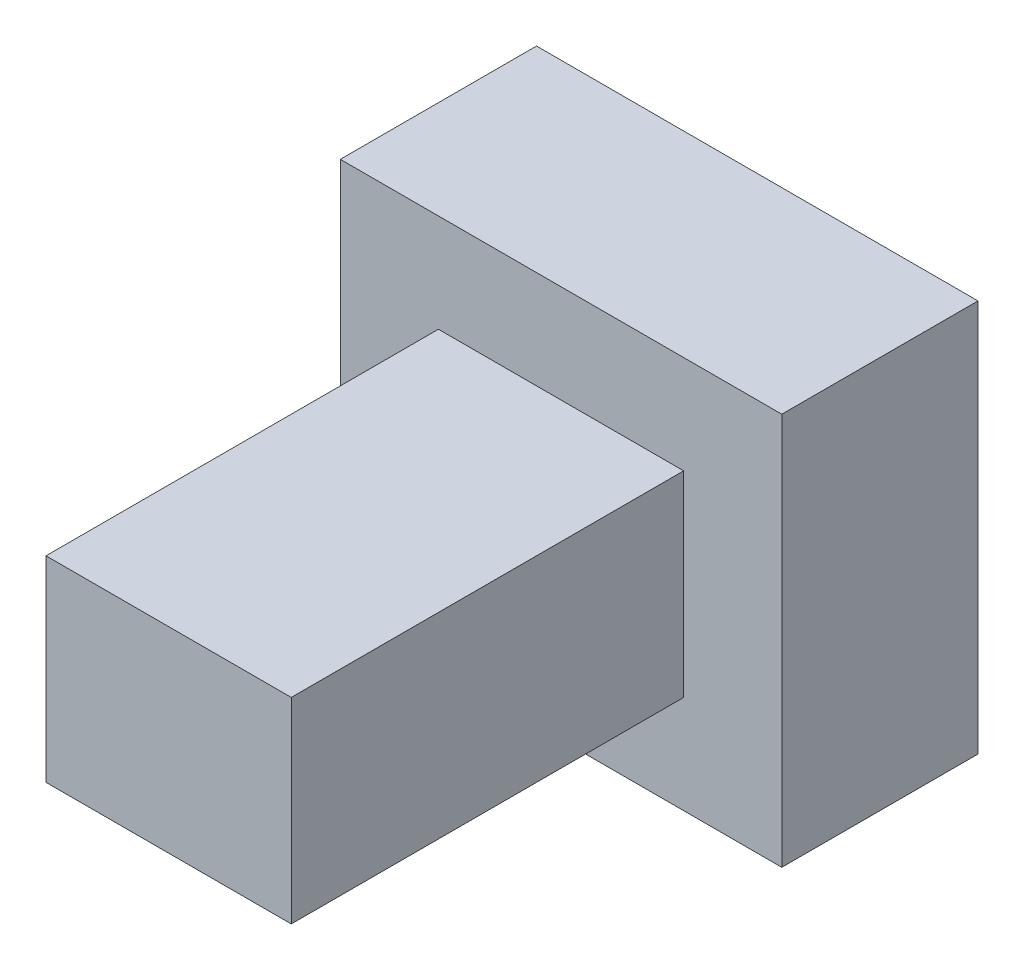
ISO-10303-21;
HEADER;
FILE_DESCRIPTION(('STEP AP214'),'2;1');
FILE_NAME('part.step','',(''),(''),'','','');
FILE_SCHEMA(('AUTOMOTIVE_DESIGN { 1 0 10303 214 1 1 1 1 }'));
ENDSEC;
DATA;
#1=APPLICATION_CONTEXT('core data for automotive mechanical design processes');
#2=APPLICATION_PROTOCOL_DEFINITION('international standard','automotive_design',2000,#1);
#3=PRODUCT_CONTEXT('',#1,'mechanical');
#4=PRODUCT('Part','Part','',(#3));
#5=PRODUCT_RELATED_PRODUCT_CATEGORY('part','',(#4));
#6=PRODUCT_DEFINITION_FORMATION('','',#4);
#7=PRODUCT_DEFINITION_CONTEXT('part definition',#1,'design');
#8=PRODUCT_DEFINITION('design','',#6,#7);
#9=PRODUCT_DEFINITION_SHAPE('','',#8);
#10=(LENGTH_UNIT() NAMED_UNIT(*) SI_UNIT(.MILLI.,.METRE.));
#11=(NAMED_UNIT(*) PLANE_ANGLE_UNIT() SI_UNIT($,.RADIAN.));
#12=(NAMED_UNIT(*) SI_UNIT($,.STERADIAN.) SOLID_ANGLE_UNIT());
#13=UNCERTAINTY_MEASURE_WITH_UNIT(LENGTH_MEASURE(1.E-05),#10,'distance_accuracy_value','');
#14=(GEOMETRIC_REPRESENTATION_CONTEXT(3) GLOBAL_UNCERTAINTY_ASSIGNED_CONTEXT((#13)) GLOBAL_UNIT_ASSIGNED_CONTEXT((#10,
#11,#12)) REPRESENTATION_CONTEXT('',''));
#15=CARTESIAN_POINT('',(0.,0.,0.));
#16=DIRECTION('',(0.,0.,1.));
#17=DIRECTION('',(1.,0.,0.));
#18=AXIS2_PLACEMENT_3D('',#15,#16,#17);
#19=CARTESIAN_POINT('',(0.,0.,5.));
#20=DIRECTION('',(1.,0.,0.));
#21=DIRECTION('',(0.,1.,0.));
#22=AXIS2_PLACEMENT_3D('',#19,#20,#21);
#23=PLANE('',#22);
#24=DIRECTION('',(0.,1.,0.));
#25=VECTOR('',#24,1.);
#26=CARTESIAN_POINT('',(0.,0.,1.));
#27=LINE('',#26,#25);
#28=CARTESIAN_POINT('',(0.,0.,1.));
#29=VERTEX_POINT('',#28);
#30=CARTESIAN_POINT('',(0.,2.,1.));
#31=VERTEX_POINT('',#30);
#32=EDGE_CURVE('E60',#29,#31,#27,.T.);
#33=ORIENTED_EDGE('',*,*,#32,.F.);
#34=DIRECTION('',(0.,0.,-1.));
#35=VECTOR('',#34,1.);
#36=CARTESIAN_POINT('',(0.,0.,5.));
#37=LINE('',#36,#35);
#38=CARTESIAN_POINT('',(0.,0.,5.));
#39=VERTEX_POINT('',#38);
#40=EDGE_CURVE('E11',#39,#29,#37,.T.);
#41=ORIENTED_EDGE('',*,*,#40,.F.);
#42=DIRECTION('',(0.,-1.,0.));
#43=VECTOR('',#42,1.);
#44=CARTESIAN_POINT('',(0.,0.,5.));
#45=LINE('',#44,#43);
#46=CARTESIAN_POINT('',(0.,2.,5.));
#47=VERTEX_POINT('',#46);
#48=EDGE_CURVE('E234',#47,#39,#45,.T.);
#49=ORIENTED_EDGE('',*,*,#48,.F.);
#50=DIRECTION('',(0.,0.,-1.));
#51=VECTOR('',#50,1.);
#52=CARTESIAN_POINT('',(0.,2.,5.));
#53=LINE('',#52,#51);
#54=EDGE_CURVE('E248',#47,#31,#53,.T.);
#55=ORIENTED_EDGE('',*,*,#54,.T.);
#56=EDGE_LOOP('',(#33,#41,#49,#55));
#57=FACE_BOUND('',#56,.T.);
#58=ADVANCED_FACE('F45',(#57),#23,.F.);
#59=CARTESIAN_POINT('',(0.,0.,5.));
#60=DIRECTION('',(0.,1.,0.));
#61=DIRECTION('',(0.,0.,1.));
#62=AXIS2_PLACEMENT_3D('',#59,#60,#61);
#63=PLANE('',#62);
#64=DIRECTION('',(-1.,0.,0.));
#65=VECTOR('',#64,1.);
#66=CARTESIAN_POINT('',(2.5,0.,1.));
#67=LINE('',#66,#65);
#68=CARTESIAN_POINT('',(2.5,0.,1.));
#69=VERTEX_POINT('',#68);
#70=EDGE_CURVE('E66',#69,#29,#67,.T.);
#71=ORIENTED_EDGE('',*,*,#70,.F.);
#72=DIRECTION('',(0.,0.,-1.));
#73=VECTOR('',#72,1.);
#74=CARTESIAN_POINT('',(2.5,0.,5.));
#75=LINE('',#74,#73);
#76=CARTESIAN_POINT('',(2.5,0.,5.));
#77=VERTEX_POINT('',#76);
#78=EDGE_CURVE('E53',#77,#69,#75,.T.);
#79=ORIENTED_EDGE('',*,*,#78,.F.);
#80=DIRECTION('',(1.,0.,0.));
#81=VECTOR('',#80,1.);
#82=CARTESIAN_POINT('',(0.,0.,5.));
#83=LINE('',#82,#81);
#84=EDGE_CURVE('E238',#39,#77,#83,.T.);
#85=ORIENTED_EDGE('',*,*,#84,.F.);
#86=ORIENTED_EDGE('',*,*,#40,.T.);
#87=EDGE_LOOP('',(#71,#79,#85,#86));
#88=FACE_BOUND('',#87,.T.);
#89=ADVANCED_FACE('F281',(#88),#63,.F.);
#90=CARTESIAN_POINT('',(2.5,0.,5.));
#91=DIRECTION('',(-1.,0.,0.));
#92=DIRECTION('',(0.,-1.,0.));
#93=AXIS2_PLACEMENT_3D('',#90,#91,#92);
#94=PLANE('',#93);
#95=DIRECTION('',(0.,-1.,0.));
#96=VECTOR('',#95,1.);
#97=CARTESIAN_POINT('',(2.5,2.,1.));
#98=LINE('',#97,#96);
#99=CARTESIAN_POINT('',(2.5,2.,1.));
#100=VERTEX_POINT('',#99);
#101=EDGE_CURVE('E149',#100,#69,#98,.T.);
#102=ORIENTED_EDGE('',*,*,#101,.F.);
#103=DIRECTION('',(0.,0.,-1.));
#104=VECTOR('',#103,1.);
#105=CARTESIAN_POINT('',(2.5,2.,5.));
#106=LINE('',#105,#104);
#107=CARTESIAN_POINT('',(2.5,2.,5.));
#108=VERTEX_POINT('',#107);
#109=EDGE_CURVE('E263',#108,#100,#106,.T.);
#110=ORIENTED_EDGE('',*,*,#109,.F.);
#111=DIRECTION('',(0.,1.,0.));
#112=VECTOR('',#111,1.);
#113=CARTESIAN_POINT('',(2.5,0.,5.));
#114=LINE('',#113,#112);
#115=EDGE_CURVE('E242',#77,#108,#114,.T.);
#116=ORIENTED_EDGE('',*,*,#115,.F.);
#117=ORIENTED_EDGE('',*,*,#78,.T.);
#118=EDGE_LOOP('',(#102,#110,#116,#117));
#119=FACE_BOUND('',#118,.T.);
#120=ADVANCED_FACE('F269',(#119),#94,.F.);
#121=CARTESIAN_POINT('',(0.,2.,5.));
#122=DIRECTION('',(0.,-1.,0.));
#123=DIRECTION('',(0.,0.,-1.));
#124=AXIS2_PLACEMENT_3D('',#121,#122,#123);
#125=PLANE('',#124);
#126=DIRECTION('',(1.,0.,0.));
#127=VECTOR('',#126,1.);
#128=CARTESIAN_POINT('',(0.,2.,1.));
#129=LINE('',#128,#127);
#130=EDGE_CURVE('E192',#31,#100,#129,.T.);
#131=ORIENTED_EDGE('',*,*,#130,.F.);
#132=ORIENTED_EDGE('',*,*,#54,.F.);
#133=DIRECTION('',(-1.,0.,0.));
#134=VECTOR('',#133,1.);
#135=CARTESIAN_POINT('',(0.,2.,5.));
#136=LINE('',#135,#134);
#137=EDGE_CURVE('E245',#108,#47,#136,.T.);
#138=ORIENTED_EDGE('',*,*,#137,.F.);
#139=ORIENTED_EDGE('',*,*,#109,.T.);
#140=EDGE_LOOP('',(#131,#132,#138,#139));
#141=FACE_BOUND('',#140,.T.);
#142=ADVANCED_FACE('F276',(#141),#125,.F.);
#143=CARTESIAN_POINT('',(0.,0.,5.));
#144=DIRECTION('',(0.,0.,-1.));
#145=DIRECTION('',(-1.,0.,0.));
#146=AXIS2_PLACEMENT_3D('',#143,#144,#145);
#147=PLANE('',#146);
#148=ORIENTED_EDGE('',*,*,#48,.T.);
#149=ORIENTED_EDGE('',*,*,#84,.T.);
#150=ORIENTED_EDGE('',*,*,#115,.T.);
#151=ORIENTED_EDGE('',*,*,#137,.T.);
#152=EDGE_LOOP('',(#148,#149,#150,#151));
#153=FACE_BOUND('',#152,.T.);
#154=ADVANCED_FACE('F280',(#153),#147,.F.);
#155=CARTESIAN_POINT('',(-1.,3.,1.));
#156=DIRECTION('',(0.,1.,0.));
#157=DIRECTION('',(0.,0.,1.));
#158=AXIS2_PLACEMENT_3D('',#155,#156,#157);
#159=PLANE('',#158);
#160=DIRECTION('',(0.,0.,-1.));
#161=VECTOR('',#160,1.);
#162=CARTESIAN_POINT('',(3.5,3.,1.));
#163=LINE('',#162,#161);
#164=CARTESIAN_POINT('',(3.5,3.,1.));
#165=VERTEX_POINT('',#164);
#166=CARTESIAN_POINT('',(3.5,3.,-1.));
#167=VERTEX_POINT('',#166);
#168=EDGE_CURVE('E222',#165,#167,#163,.T.);
#169=ORIENTED_EDGE('',*,*,#168,.T.);
#170=DIRECTION('',(1.,0.,0.));
#171=VECTOR('',#170,1.);
#172=CARTESIAN_POINT('',(-1.,3.,-1.));
#173=LINE('',#172,#171);
#174=CARTESIAN_POINT('',(-1.,3.,-1.));
#175=VERTEX_POINT('',#174);
#176=EDGE_CURVE('E172',#175,#167,#173,.T.);
#177=ORIENTED_EDGE('',*,*,#176,.F.);
#178=DIRECTION('',(0.,0.,-1.));
#179=VECTOR('',#178,1.);
#180=CARTESIAN_POINT('',(-1.,3.,1.));
#181=LINE('',#180,#179);
#182=CARTESIAN_POINT('',(-1.,3.,1.));
#183=VERTEX_POINT('',#182);
#184=EDGE_CURVE('E223',#183,#175,#181,.T.);
#185=ORIENTED_EDGE('',*,*,#184,.F.);
#186=DIRECTION('',(1.,0.,0.));
#187=VECTOR('',#186,1.);
#188=CARTESIAN_POINT('',(-1.,3.,1.));
#189=LINE('',#188,#187);
#190=EDGE_CURVE('E201',#183,#165,#189,.T.);
#191=ORIENTED_EDGE('',*,*,#190,.T.);
#192=EDGE_LOOP('',(#169,#177,#185,#191));
#193=FACE_BOUND('',#192,.T.);
#194=ADVANCED_FACE('F297',(#193),#159,.T.);
#195=CARTESIAN_POINT('',(-1.,-1.,1.));
#196=DIRECTION('',(-1.,0.,0.));
#197=DIRECTION('',(0.,0.,1.));
#198=AXIS2_PLACEMENT_3D('',#195,#196,#197);
#199=PLANE('',#198);
#200=ORIENTED_EDGE('',*,*,#184,.T.);
#201=DIRECTION('',(0.,1.,0.));
#202=VECTOR('',#201,1.);
#203=CARTESIAN_POINT('',(-1.,-1.,-1.));
#204=LINE('',#203,#202);
#205=CARTESIAN_POINT('',(-1.,-1.,-1.));
#206=VERTEX_POINT('',#205);
#207=EDGE_CURVE('E184',#206,#175,#204,.T.);
#208=ORIENTED_EDGE('',*,*,#207,.F.);
#209=DIRECTION('',(0.,0.,-1.));
#210=VECTOR('',#209,1.);
#211=CARTESIAN_POINT('',(-1.,-1.,1.));
#212=LINE('',#211,#210);
#213=CARTESIAN_POINT('',(-1.,-1.,1.));
#214=VERTEX_POINT('',#213);
#215=EDGE_CURVE('E226',#214,#206,#212,.T.);
#216=ORIENTED_EDGE('',*,*,#215,.F.);
#217=DIRECTION('',(0.,1.,0.));
#218=VECTOR('',#217,1.);
#219=CARTESIAN_POINT('',(-1.,-1.,1.));
#220=LINE('',#219,#218);
#221=EDGE_CURVE('E218',#214,#183,#220,.T.);
#222=ORIENTED_EDGE('',*,*,#221,.T.);
#223=EDGE_LOOP('',(#200,#208,#216,#222));
#224=FACE_BOUND('',#223,.T.);
#225=ADVANCED_FACE('F300',(#224),#199,.T.);
#226=CARTESIAN_POINT('',(3.5,-1.,1.));
#227=DIRECTION('',(0.,-1.,0.));
#228=DIRECTION('',(0.,0.,-1.));
#229=AXIS2_PLACEMENT_3D('',#226,#227,#228);
#230=PLANE('',#229);
#231=ORIENTED_EDGE('',*,*,#215,.T.);
#232=DIRECTION('',(-1.,0.,0.));
#233=VECTOR('',#232,1.);
#234=CARTESIAN_POINT('',(3.5,-1.,-1.));
#235=LINE('',#234,#233);
#236=CARTESIAN_POINT('',(3.5,-1.,-1.));
#237=VERTEX_POINT('',#236);
#238=EDGE_CURVE('E180',#237,#206,#235,.T.);
#239=ORIENTED_EDGE('',*,*,#238,.F.);
#240=DIRECTION('',(0.,0.,-1.));
#241=VECTOR('',#240,1.);
#242=CARTESIAN_POINT('',(3.5,-1.,1.));
#243=LINE('',#242,#241);
#244=CARTESIAN_POINT('',(3.5,-1.,1.));
#245=VERTEX_POINT('',#244);
#246=EDGE_CURVE('E229',#245,#237,#243,.T.);
#247=ORIENTED_EDGE('',*,*,#246,.F.);
#248=DIRECTION('',(-1.,0.,0.));
#249=VECTOR('',#248,1.);
#250=CARTESIAN_POINT('',(3.5,-1.,1.));
#251=LINE('',#250,#249);
#252=EDGE_CURVE('E214',#245,#214,#251,.T.);
#253=ORIENTED_EDGE('',*,*,#252,.T.);
#254=EDGE_LOOP('',(#231,#239,#247,#253));
#255=FACE_BOUND('',#254,.T.);
#256=ADVANCED_FACE('F305',(#255),#230,.T.);
#257=CARTESIAN_POINT('',(3.5,3.,1.));
#258=DIRECTION('',(1.,0.,0.));
#259=DIRECTION('',(0.,0.,-1.));
#260=AXIS2_PLACEMENT_3D('',#257,#258,#259);
#261=PLANE('',#260);
#262=ORIENTED_EDGE('',*,*,#246,.T.);
#263=DIRECTION('',(0.,-1.,0.));
#264=VECTOR('',#263,1.);
#265=CARTESIAN_POINT('',(3.5,3.,-1.));
#266=LINE('',#265,#264);
#267=EDGE_CURVE('E176',#167,#237,#266,.T.);
#268=ORIENTED_EDGE('',*,*,#267,.F.);
#269=ORIENTED_EDGE('',*,*,#168,.F.);
#270=DIRECTION('',(0.,-1.,0.));
#271=VECTOR('',#270,1.);
#272=CARTESIAN_POINT('',(3.5,3.,1.));
#273=LINE('',#272,#271);
#274=EDGE_CURVE('E210',#165,#245,#273,.T.);
#275=ORIENTED_EDGE('',*,*,#274,.T.);
#276=EDGE_LOOP('',(#262,#268,#269,#275));
#277=FACE_BOUND('',#276,.T.);
#278=ADVANCED_FACE('F302',(#277),#261,.T.);
#279=CARTESIAN_POINT('',(0.,0.,1.));
#280=DIRECTION('',(0.,0.,-1.));
#281=DIRECTION('',(-1.,0.,0.));
#282=AXIS2_PLACEMENT_3D('',#279,#280,#281);
#283=PLANE('',#282);
#284=ORIENTED_EDGE('',*,*,#101,.T.);
#285=ORIENTED_EDGE('',*,*,#70,.T.);
#286=ORIENTED_EDGE('',*,*,#32,.T.);
#287=ORIENTED_EDGE('',*,*,#130,.T.);
#288=EDGE_LOOP('',(#284,#285,#286,#287));
#289=FACE_BOUND('',#288,.T.);
#290=ORIENTED_EDGE('',*,*,#190,.F.);
#291=ORIENTED_EDGE('',*,*,#221,.F.);
#292=ORIENTED_EDGE('',*,*,#252,.F.);
#293=ORIENTED_EDGE('',*,*,#274,.F.);
#294=EDGE_LOOP('',(#290,#291,#292,#293));
#295=FACE_BOUND('',#294,.T.);
#296=ADVANCED_FACE('F272',(#289,#295),#283,.F.);
#297=CARTESIAN_POINT('',(2.5,0.,1.));
#298=DIRECTION('',(0.,-1.,0.));
#299=DIRECTION('',(0.,0.,-1.));
#300=AXIS2_PLACEMENT_3D('',#297,#298,#299);
#301=PLANE('',#300);
#302=DIRECTION('',(1.,0.,0.));
#303=VECTOR('',#302,1.);
#304=CARTESIAN_POINT('',(0.,0.,0.));
#305=LINE('',#304,#303);
#306=CARTESIAN_POINT('',(0.,0.,0.));
#307=VERTEX_POINT('',#306);
#308=CARTESIAN_POINT('',(2.5,0.,0.));
#309=VERTEX_POINT('',#308);
#310=EDGE_CURVE('E251',#307,#309,#305,.T.);
#311=ORIENTED_EDGE('',*,*,#310,.T.);
#312=DIRECTION('',(0.,0.,-1.));
#313=VECTOR('',#312,1.);
#314=CARTESIAN_POINT('',(2.5,0.,1.));
#315=LINE('',#314,#313);
#316=CARTESIAN_POINT('',(2.5,0.,-1.));
#317=VERTEX_POINT('',#316);
#318=EDGE_CURVE('E155',#309,#317,#315,.T.);
#319=ORIENTED_EDGE('',*,*,#318,.T.);
#320=DIRECTION('',(-1.,0.,0.));
#321=VECTOR('',#320,1.);
#322=CARTESIAN_POINT('',(2.5,0.,-1.));
#323=LINE('',#322,#321);
#324=CARTESIAN_POINT('',(0.,0.,-1.));
#325=VERTEX_POINT('',#324);
#326=EDGE_CURVE('E152',#317,#325,#323,.T.);
#327=ORIENTED_EDGE('',*,*,#326,.T.);
#328=DIRECTION('',(0.,0.,-1.));
#329=VECTOR('',#328,1.);
#330=CARTESIAN_POINT('',(0.,0.,1.));
#331=LINE('',#330,#329);
#332=EDGE_CURVE('E137',#307,#325,#331,.T.);
#333=ORIENTED_EDGE('',*,*,#332,.F.);
#334=EDGE_LOOP('',(#311,#319,#327,#333));
#335=FACE_BOUND('',#334,.T.);
#336=ADVANCED_FACE('F153',(#335),#301,.F.);
#337=CARTESIAN_POINT('',(2.5,2.,1.));
#338=DIRECTION('',(1.,0.,0.));
#339=DIRECTION('',(0.,1.,0.));
#340=AXIS2_PLACEMENT_3D('',#337,#338,#339);
#341=PLANE('',#340);
#342=DIRECTION('',(0.,1.,0.));
#343=VECTOR('',#342,1.);
#344=CARTESIAN_POINT('',(2.5,0.,0.));
#345=LINE('',#344,#343);
#346=CARTESIAN_POINT('',(2.5,2.,0.));
#347=VERTEX_POINT('',#346);
#348=EDGE_CURVE('E254',#309,#347,#345,.T.);
#349=ORIENTED_EDGE('',*,*,#348,.T.);
#350=DIRECTION('',(0.,0.,-1.));
#351=VECTOR('',#350,1.);
#352=CARTESIAN_POINT('',(2.5,2.,1.));
#353=LINE('',#352,#351);
#354=CARTESIAN_POINT('',(2.5,2.,-1.));
#355=VERTEX_POINT('',#354);
#356=EDGE_CURVE('E202',#347,#355,#353,.T.);
#357=ORIENTED_EDGE('',*,*,#356,.T.);
#358=DIRECTION('',(0.,-1.,0.));
#359=VECTOR('',#358,1.);
#360=CARTESIAN_POINT('',(2.5,2.,-1.));
#361=LINE('',#360,#359);
#362=EDGE_CURVE('E167',#355,#317,#361,.T.);
#363=ORIENTED_EDGE('',*,*,#362,.T.);
#364=ORIENTED_EDGE('',*,*,#318,.F.);
#365=EDGE_LOOP('',(#349,#357,#363,#364));
#366=FACE_BOUND('',#365,.T.);
#367=ADVANCED_FACE('F317',(#366),#341,.F.);
#368=CARTESIAN_POINT('',(0.,2.,1.));
#369=DIRECTION('',(0.,1.,0.));
#370=DIRECTION('',(0.,0.,1.));
#371=AXIS2_PLACEMENT_3D('',#368,#369,#370);
#372=PLANE('',#371);
#373=DIRECTION('',(-1.,0.,0.));
#374=VECTOR('',#373,1.);
#375=CARTESIAN_POINT('',(0.,2.,0.));
#376=LINE('',#375,#374);
#377=CARTESIAN_POINT('',(0.,2.,0.));
#378=VERTEX_POINT('',#377);
#379=EDGE_CURVE('E239',#347,#378,#376,.T.);
#380=ORIENTED_EDGE('',*,*,#379,.T.);
#381=DIRECTION('',(0.,0.,-1.));
#382=VECTOR('',#381,1.);
#383=CARTESIAN_POINT('',(0.,2.,1.));
#384=LINE('',#383,#382);
#385=CARTESIAN_POINT('',(0.,2.,-1.));
#386=VERTEX_POINT('',#385);
#387=EDGE_CURVE('E148',#378,#386,#384,.T.);
#388=ORIENTED_EDGE('',*,*,#387,.T.);
#389=DIRECTION('',(1.,0.,0.));
#390=VECTOR('',#389,1.);
#391=CARTESIAN_POINT('',(0.,2.,-1.));
#392=LINE('',#391,#390);
#393=EDGE_CURVE('E163',#386,#355,#392,.T.);
#394=ORIENTED_EDGE('',*,*,#393,.T.);
#395=ORIENTED_EDGE('',*,*,#356,.F.);
#396=EDGE_LOOP('',(#380,#388,#394,#395));
#397=FACE_BOUND('',#396,.T.);
#398=ADVANCED_FACE('F320',(#397),#372,.F.);
#399=CARTESIAN_POINT('',(0.,0.,1.));
#400=DIRECTION('',(-1.,0.,0.));
#401=DIRECTION('',(0.,-1.,0.));
#402=AXIS2_PLACEMENT_3D('',#399,#400,#401);
#403=PLANE('',#402);
#404=DIRECTION('',(0.,-1.,0.));
#405=VECTOR('',#404,1.);
#406=CARTESIAN_POINT('',(0.,0.,0.));
#407=LINE('',#406,#405);
#408=EDGE_CURVE('E144',#378,#307,#407,.T.);
#409=ORIENTED_EDGE('',*,*,#408,.T.);
#410=ORIENTED_EDGE('',*,*,#332,.T.);
#411=DIRECTION('',(0.,1.,0.));
#412=VECTOR('',#411,1.);
#413=CARTESIAN_POINT('',(0.,0.,-1.));
#414=LINE('',#413,#412);
#415=EDGE_CURVE('E142',#325,#386,#414,.T.);
#416=ORIENTED_EDGE('',*,*,#415,.T.);
#417=ORIENTED_EDGE('',*,*,#387,.F.);
#418=EDGE_LOOP('',(#409,#410,#416,#417));
#419=FACE_BOUND('',#418,.T.);
#420=ADVANCED_FACE('F139',(#419),#403,.F.);
#421=CARTESIAN_POINT('',(0.,0.,-1.));
#422=DIRECTION('',(0.,0.,-1.));
#423=DIRECTION('',(-1.,0.,0.));
#424=AXIS2_PLACEMENT_3D('',#421,#422,#423);
#425=PLANE('',#424);
#426=ORIENTED_EDGE('',*,*,#176,.T.);
#427=ORIENTED_EDGE('',*,*,#267,.T.);
#428=ORIENTED_EDGE('',*,*,#238,.T.);
#429=ORIENTED_EDGE('',*,*,#207,.T.);
#430=EDGE_LOOP('',(#426,#427,#428,#429));
#431=FACE_BOUND('',#430,.T.);
#432=ORIENTED_EDGE('',*,*,#415,.F.);
#433=ORIENTED_EDGE('',*,*,#326,.F.);
#434=ORIENTED_EDGE('',*,*,#362,.F.);
#435=ORIENTED_EDGE('',*,*,#393,.F.);
#436=EDGE_LOOP('',(#432,#433,#434,#435));
#437=FACE_BOUND('',#436,.T.);
#438=ADVANCED_FACE('F161',(#431,#437),#425,.T.);
#439=CARTESIAN_POINT('',(0.,0.,0.));
#440=DIRECTION('',(0.,0.,-1.));
#441=DIRECTION('',(-1.,0.,0.));
#442=AXIS2_PLACEMENT_3D('',#439,#440,#441);
#443=PLANE('',#442);
#444=ORIENTED_EDGE('',*,*,#408,.F.);
#445=ORIENTED_EDGE('',*,*,#379,.F.);
#446=ORIENTED_EDGE('',*,*,#348,.F.);
#447=ORIENTED_EDGE('',*,*,#310,.F.);
#448=EDGE_LOOP('',(#444,#445,#446,#447));
#449=FACE_BOUND('',#448,.T.);
#450=ADVANCED_FACE('F291',(#449),#443,.T.);
#451=CLOSED_SHELL('',(#58,#89,#120,#142,#154,#194,#225,#256,#278,#296,#336,#367,#398,#420,#438,#450));
#452=MANIFOLD_SOLID_BREP('B2',#451);
#453=ADVANCED_BREP_SHAPE_REPRESENTATION('',(#18,#452),#14);
#454=SHAPE_DEFINITION_REPRESENTATION(#9,#453);
ENDSEC;
END-ISO-10303-21;
